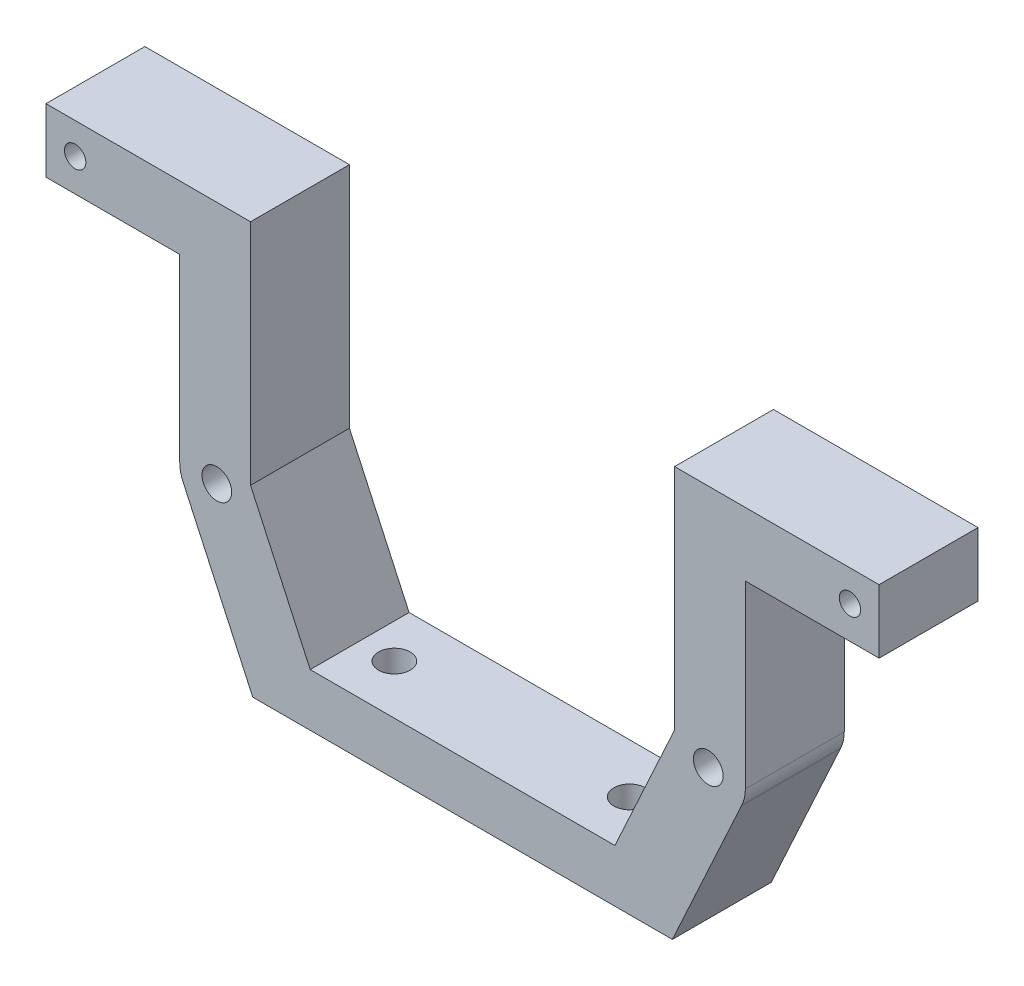
ISO-10303-21;
HEADER;
FILE_DESCRIPTION(('STEP AP214'),'2;1');
FILE_NAME('part.step','',(''),(''),'','','');
FILE_SCHEMA(('AUTOMOTIVE_DESIGN { 1 0 10303 214 1 1 1 1 }'));
ENDSEC;
DATA;
#1=APPLICATION_CONTEXT('core data for automotive mechanical design processes');
#2=APPLICATION_PROTOCOL_DEFINITION('international standard','automotive_design',2000,#1);
#3=PRODUCT_CONTEXT('',#1,'mechanical');
#4=PRODUCT('Part','Part','',(#3));
#5=PRODUCT_RELATED_PRODUCT_CATEGORY('part','',(#4));
#6=PRODUCT_DEFINITION_FORMATION('','',#4);
#7=PRODUCT_DEFINITION_CONTEXT('part definition',#1,'design');
#8=PRODUCT_DEFINITION('design','',#6,#7);
#9=PRODUCT_DEFINITION_SHAPE('','',#8);
#10=(LENGTH_UNIT() NAMED_UNIT(*) SI_UNIT(.MILLI.,.METRE.));
#11=(NAMED_UNIT(*) PLANE_ANGLE_UNIT() SI_UNIT($,.RADIAN.));
#12=(NAMED_UNIT(*) SI_UNIT($,.STERADIAN.) SOLID_ANGLE_UNIT());
#13=UNCERTAINTY_MEASURE_WITH_UNIT(LENGTH_MEASURE(1.E-05),#10,'distance_accuracy_value','');
#14=(GEOMETRIC_REPRESENTATION_CONTEXT(3) GLOBAL_UNCERTAINTY_ASSIGNED_CONTEXT((#13)) GLOBAL_UNIT_ASSIGNED_CONTEXT((#10,
#11,#12)) REPRESENTATION_CONTEXT('',''));
#15=CARTESIAN_POINT('',(0.,0.,0.));
#16=DIRECTION('',(0.,0.,1.));
#17=DIRECTION('',(1.,0.,0.));
#18=AXIS2_PLACEMENT_3D('',#15,#16,#17);
#19=CARTESIAN_POINT('',(31.5545702888792,8.97930902224725,12.7));
#20=DIRECTION('',(0.,0.,-1.));
#21=DIRECTION('',(-1.,0.,0.));
#22=AXIS2_PLACEMENT_3D('',#19,#20,#21);
#23=PLANE('',#22);
#24=CARTESIAN_POINT('',(31.5545702888792,8.97930902224725,12.7));
#25=DIRECTION('',(0.,0.,1.));
#26=DIRECTION('',(-1.,0.,0.));
#27=AXIS2_PLACEMENT_3D('',#24,#25,#26);
#28=CIRCLE('',#27,1.905);
#29=CARTESIAN_POINT('',(29.6495702888792,8.97930902224725,12.7));
#30=VERTEX_POINT('',#29);
#31=EDGE_CURVE('E290',#30,#30,#28,.T.);
#32=ORIENTED_EDGE('',*,*,#31,.F.);
#33=EDGE_LOOP('',(#32));
#34=FACE_BOUND('',#33,.T.);
#35=CARTESIAN_POINT('',(-49.7493059568274,36.2842713695044,12.7));
#36=DIRECTION('',(0.,0.,1.));
#37=DIRECTION('',(1.,0.,0.));
#38=AXIS2_PLACEMENT_3D('',#35,#36,#37);
#39=CIRCLE('',#38,1.3716);
#40=CARTESIAN_POINT('',(-48.3777059568274,36.2842713695044,12.7));
#41=VERTEX_POINT('',#40);
#42=EDGE_CURVE('E198',#41,#41,#39,.T.);
#43=ORIENTED_EDGE('',*,*,#42,.F.);
#44=EDGE_LOOP('',(#43));
#45=FACE_BOUND('',#44,.T.);
#46=DIRECTION('',(0.,1.,0.));
#47=VECTOR('',#46,1.);
#48=CARTESIAN_POINT('',(-27.2257695935493,40.2784040455911,12.7));
#49=LINE('',#48,#47);
#50=CARTESIAN_POINT('',(-27.2257695935493,10.9692609139896,12.7));
#51=VERTEX_POINT('',#50);
#52=CARTESIAN_POINT('',(-27.2257695935493,40.2784040455911,12.7));
#53=VERTEX_POINT('',#52);
#54=EDGE_CURVE('E229',#51,#53,#49,.T.);
#55=ORIENTED_EDGE('',*,*,#54,.T.);
#56=DIRECTION('',(-1.,0.,0.));
#57=VECTOR('',#56,1.);
#58=CARTESIAN_POINT('',(-53.4924781457748,40.2784040455911,12.7));
#59=LINE('',#58,#57);
#60=CARTESIAN_POINT('',(-53.4924781457748,40.2784040455911,12.7));
#61=VERTEX_POINT('',#60);
#62=EDGE_CURVE('E127',#53,#61,#59,.T.);
#63=ORIENTED_EDGE('',*,*,#62,.T.);
#64=DIRECTION('',(0.,-1.,0.));
#65=VECTOR('',#64,1.);
#66=CARTESIAN_POINT('',(-53.4924781457748,32.0981433403628,12.7));
#67=LINE('',#66,#65);
#68=CARTESIAN_POINT('',(-53.4924781457748,32.0981433403628,12.7));
#69=VERTEX_POINT('',#68);
#70=EDGE_CURVE('E308',#61,#69,#67,.T.);
#71=ORIENTED_EDGE('',*,*,#70,.T.);
#72=DIRECTION('',(1.,0.,0.));
#73=VECTOR('',#72,1.);
#74=CARTESIAN_POINT('',(-36.3188565933879,32.0981433403628,12.7));
#75=LINE('',#74,#73);
#76=CARTESIAN_POINT('',(-36.3188565933879,32.0981433403628,12.7));
#77=VERTEX_POINT('',#76);
#78=EDGE_CURVE('E310',#69,#77,#75,.T.);
#79=ORIENTED_EDGE('',*,*,#78,.T.);
#80=DIRECTION('',(0.,-1.,0.));
#81=VECTOR('',#80,1.);
#82=CARTESIAN_POINT('',(-36.318856593388,8.97930902224725,12.7));
#83=LINE('',#82,#81);
#84=CARTESIAN_POINT('',(-36.318856593388,8.97930902224725,12.7));
#85=VERTEX_POINT('',#84);
#86=EDGE_CURVE('E312',#77,#85,#83,.T.);
#87=ORIENTED_EDGE('',*,*,#86,.T.);
#88=CARTESIAN_POINT('',(-31.5545702888788,8.97930902224726,12.7));
#89=DIRECTION('',(0.,0.,1.));
#90=DIRECTION('',(1.,0.,0.));
#91=AXIS2_PLACEMENT_3D('',#88,#89,#90);
#92=CIRCLE('',#91,4.76428630450919);
#93=CARTESIAN_POINT('',(-35.8252422231693,6.86748866506799,12.7));
#94=VERTEX_POINT('',#93);
#95=EDGE_CURVE('E314',#85,#94,#92,.T.);
#96=ORIENTED_EDGE('',*,*,#95,.T.);
#97=DIRECTION('',(0.417681004993124,-0.908593736533515,0.));
#98=VECTOR('',#97,1.);
#99=CARTESIAN_POINT('',(-26.9440305515199,-12.4520714806509,12.7));
#100=LINE('',#99,#98);
#101=CARTESIAN_POINT('',(-26.9440305515199,-12.4520714806509,12.7));
#102=VERTEX_POINT('',#101);
#103=EDGE_CURVE('E316',#94,#102,#100,.T.);
#104=ORIENTED_EDGE('',*,*,#103,.T.);
#105=DIRECTION('',(1.,0.,0.));
#106=VECTOR('',#105,1.);
#107=CARTESIAN_POINT('',(26.94403055152,-12.4520714806509,12.7));
#108=LINE('',#107,#106);
#109=CARTESIAN_POINT('',(26.94403055152,-12.4520714806509,12.7));
#110=VERTEX_POINT('',#109);
#111=EDGE_CURVE('E318',#102,#110,#108,.T.);
#112=ORIENTED_EDGE('',*,*,#111,.T.);
#113=DIRECTION('',(0.417681004993124,0.908593736533515,0.));
#114=VECTOR('',#113,1.);
#115=CARTESIAN_POINT('',(26.94403055152,-12.4520714806509,12.7));
#116=LINE('',#115,#114);
#117=CARTESIAN_POINT('',(35.8252422231693,6.867488665068,12.7));
#118=VERTEX_POINT('',#117);
#119=EDGE_CURVE('E320',#110,#118,#116,.T.);
#120=ORIENTED_EDGE('',*,*,#119,.T.);
#121=CARTESIAN_POINT('',(31.5545702888792,8.97930902224725,12.7));
#122=DIRECTION('',(0.,0.,1.));
#123=DIRECTION('',(-1.,0.,0.));
#124=AXIS2_PLACEMENT_3D('',#121,#122,#123);
#125=CIRCLE('',#124,4.76428630450882);
#126=CARTESIAN_POINT('',(36.318856593388,8.97930902224725,12.7));
#127=VERTEX_POINT('',#126);
#128=EDGE_CURVE('E322',#118,#127,#125,.T.);
#129=ORIENTED_EDGE('',*,*,#128,.T.);
#130=DIRECTION('',(0.,1.,0.));
#131=VECTOR('',#130,1.);
#132=CARTESIAN_POINT('',(36.318856593388,8.97930902224725,12.7));
#133=LINE('',#132,#131);
#134=CARTESIAN_POINT('',(36.3188565933879,32.0981433403628,12.7));
#135=VERTEX_POINT('',#134);
#136=EDGE_CURVE('E324',#127,#135,#133,.T.);
#137=ORIENTED_EDGE('',*,*,#136,.T.);
#138=DIRECTION('',(1.,0.,0.));
#139=VECTOR('',#138,1.);
#140=CARTESIAN_POINT('',(36.3188565933879,32.0981433403628,12.7));
#141=LINE('',#140,#139);
#142=CARTESIAN_POINT('',(53.4924781457748,32.0981433403628,12.7));
#143=VERTEX_POINT('',#142);
#144=EDGE_CURVE('E326',#135,#143,#141,.T.);
#145=ORIENTED_EDGE('',*,*,#144,.T.);
#146=DIRECTION('',(0.,1.,0.));
#147=VECTOR('',#146,1.);
#148=CARTESIAN_POINT('',(53.4924781457748,32.0981433403628,12.7));
#149=LINE('',#148,#147);
#150=CARTESIAN_POINT('',(53.4924781457748,40.2784040455911,12.7));
#151=VERTEX_POINT('',#150);
#152=EDGE_CURVE('E328',#143,#151,#149,.T.);
#153=ORIENTED_EDGE('',*,*,#152,.T.);
#154=DIRECTION('',(-1.,0.,0.));
#155=VECTOR('',#154,1.);
#156=CARTESIAN_POINT('',(53.4924781457748,40.2784040455911,12.7));
#157=LINE('',#156,#155);
#158=CARTESIAN_POINT('',(27.2257695935493,40.2784040455911,12.7));
#159=VERTEX_POINT('',#158);
#160=EDGE_CURVE('E330',#151,#159,#157,.T.);
#161=ORIENTED_EDGE('',*,*,#160,.T.);
#162=DIRECTION('',(0.,-1.,0.));
#163=VECTOR('',#162,1.);
#164=CARTESIAN_POINT('',(27.2257695935493,40.2784040455911,12.7));
#165=LINE('',#164,#163);
#166=CARTESIAN_POINT('',(27.2257695935493,10.9692609139896,12.7));
#167=VERTEX_POINT('',#166);
#168=EDGE_CURVE('E176',#159,#167,#165,.T.);
#169=ORIENTED_EDGE('',*,*,#168,.T.);
#170=DIRECTION('',(-0.417681004993123,-0.908593736533515,0.));
#171=VECTOR('',#170,1.);
#172=CARTESIAN_POINT('',(27.2257695935493,10.9692609139896,12.7));
#173=LINE('',#172,#171);
#174=CARTESIAN_POINT('',(19.564927607776,-5.69559327290649,12.7));
#175=VERTEX_POINT('',#174);
#176=EDGE_CURVE('E170',#167,#175,#173,.T.);
#177=ORIENTED_EDGE('',*,*,#176,.T.);
#178=DIRECTION('',(-1.,0.,0.));
#179=VECTOR('',#178,1.);
#180=CARTESIAN_POINT('',(-19.564927607776,-5.69559327290649,12.7));
#181=LINE('',#180,#179);
#182=CARTESIAN_POINT('',(-19.564927607776,-5.69559327290649,12.7));
#183=VERTEX_POINT('',#182);
#184=EDGE_CURVE('E174',#175,#183,#181,.T.);
#185=ORIENTED_EDGE('',*,*,#184,.T.);
#186=DIRECTION('',(-0.417681004993124,0.908593736533515,0.));
#187=VECTOR('',#186,1.);
#188=CARTESIAN_POINT('',(-27.2257695935493,10.9692609139896,12.7));
#189=LINE('',#188,#187);
#190=EDGE_CURVE('E54',#183,#51,#189,.T.);
#191=ORIENTED_EDGE('',*,*,#190,.T.);
#192=EDGE_LOOP('',(#55,#63,#71,#79,#87,#96,#104,#112,#120,#129,#137,#145,#153,#161,#169,#177,
#185,#191));
#193=FACE_BOUND('',#192,.T.);
#194=CARTESIAN_POINT('',(49.7493059568274,36.2842713695044,12.7));
#195=DIRECTION('',(0.,0.,1.));
#196=DIRECTION('',(-1.,0.,0.));
#197=AXIS2_PLACEMENT_3D('',#194,#195,#196);
#198=CIRCLE('',#197,1.3716);
#199=CARTESIAN_POINT('',(48.3777059568274,36.2842713695044,12.7));
#200=VERTEX_POINT('',#199);
#201=EDGE_CURVE('E296',#200,#200,#198,.T.);
#202=ORIENTED_EDGE('',*,*,#201,.F.);
#203=EDGE_LOOP('',(#202));
#204=FACE_BOUND('',#203,.T.);
#205=CARTESIAN_POINT('',(-31.5545702888788,8.97930902224726,12.7));
#206=DIRECTION('',(0.,0.,1.));
#207=DIRECTION('',(1.,0.,0.));
#208=AXIS2_PLACEMENT_3D('',#205,#206,#207);
#209=CIRCLE('',#208,1.905);
#210=CARTESIAN_POINT('',(-29.6495702888788,8.97930902224726,12.7));
#211=VERTEX_POINT('',#210);
#212=EDGE_CURVE('E277',#211,#211,#209,.T.);
#213=ORIENTED_EDGE('',*,*,#212,.F.);
#214=EDGE_LOOP('',(#213));
#215=FACE_BOUND('',#214,.T.);
#216=ADVANCED_FACE('F35',(#34,#45,#193,#204,#215),#23,.F.);
#217=CARTESIAN_POINT('',(31.5545702888792,8.97930902224725,0.));
#218=DIRECTION('',(0.,0.,-1.));
#219=DIRECTION('',(-1.,0.,0.));
#220=AXIS2_PLACEMENT_3D('',#217,#218,#219);
#221=PLANE('',#220);
#222=CARTESIAN_POINT('',(31.5545702888792,8.97930902224725,0.));
#223=DIRECTION('',(0.,0.,1.));
#224=DIRECTION('',(-1.,0.,0.));
#225=AXIS2_PLACEMENT_3D('',#222,#223,#224);
#226=CIRCLE('',#225,1.905);
#227=CARTESIAN_POINT('',(29.6495702888792,8.97930902224725,0.));
#228=VERTEX_POINT('',#227);
#229=EDGE_CURVE('E288',#228,#228,#226,.T.);
#230=ORIENTED_EDGE('',*,*,#229,.T.);
#231=EDGE_LOOP('',(#230));
#232=FACE_BOUND('',#231,.T.);
#233=CARTESIAN_POINT('',(-49.7493059568274,36.2842713695044,0.));
#234=DIRECTION('',(0.,0.,1.));
#235=DIRECTION('',(1.,0.,0.));
#236=AXIS2_PLACEMENT_3D('',#233,#234,#235);
#237=CIRCLE('',#236,1.3716);
#238=CARTESIAN_POINT('',(-48.3777059568274,36.2842713695044,0.));
#239=VERTEX_POINT('',#238);
#240=EDGE_CURVE('E299',#239,#239,#237,.T.);
#241=ORIENTED_EDGE('',*,*,#240,.T.);
#242=EDGE_LOOP('',(#241));
#243=FACE_BOUND('',#242,.T.);
#244=DIRECTION('',(0.,1.,0.));
#245=VECTOR('',#244,1.);
#246=CARTESIAN_POINT('',(-27.2257695935493,40.2784040455911,0.));
#247=LINE('',#246,#245);
#248=CARTESIAN_POINT('',(-27.2257695935493,10.9692609139896,0.));
#249=VERTEX_POINT('',#248);
#250=CARTESIAN_POINT('',(-27.2257695935493,40.2784040455911,0.));
#251=VERTEX_POINT('',#250);
#252=EDGE_CURVE('E194',#249,#251,#247,.T.);
#253=ORIENTED_EDGE('',*,*,#252,.F.);
#254=DIRECTION('',(-0.417681004993124,0.908593736533515,0.));
#255=VECTOR('',#254,1.);
#256=CARTESIAN_POINT('',(-27.2257695935493,10.9692609139896,0.));
#257=LINE('',#256,#255);
#258=CARTESIAN_POINT('',(-19.564927607776,-5.69559327290649,0.));
#259=VERTEX_POINT('',#258);
#260=EDGE_CURVE('E119',#259,#249,#257,.T.);
#261=ORIENTED_EDGE('',*,*,#260,.F.);
#262=DIRECTION('',(-1.,0.,0.));
#263=VECTOR('',#262,1.);
#264=CARTESIAN_POINT('',(-19.564927607776,-5.69559327290649,0.));
#265=LINE('',#264,#263);
#266=CARTESIAN_POINT('',(19.564927607776,-5.69559327290649,0.));
#267=VERTEX_POINT('',#266);
#268=EDGE_CURVE('E113',#267,#259,#265,.T.);
#269=ORIENTED_EDGE('',*,*,#268,.F.);
#270=DIRECTION('',(-0.417681004993123,-0.908593736533515,0.));
#271=VECTOR('',#270,1.);
#272=CARTESIAN_POINT('',(27.2257695935493,10.9692609139896,0.));
#273=LINE('',#272,#271);
#274=CARTESIAN_POINT('',(27.2257695935493,10.9692609139896,0.));
#275=VERTEX_POINT('',#274);
#276=EDGE_CURVE('E184',#275,#267,#273,.T.);
#277=ORIENTED_EDGE('',*,*,#276,.F.);
#278=DIRECTION('',(0.,-1.,0.));
#279=VECTOR('',#278,1.);
#280=CARTESIAN_POINT('',(27.2257695935493,40.2784040455911,0.));
#281=LINE('',#280,#279);
#282=CARTESIAN_POINT('',(27.2257695935493,40.2784040455911,0.));
#283=VERTEX_POINT('',#282);
#284=EDGE_CURVE('E224',#283,#275,#281,.T.);
#285=ORIENTED_EDGE('',*,*,#284,.F.);
#286=DIRECTION('',(-1.,0.,0.));
#287=VECTOR('',#286,1.);
#288=CARTESIAN_POINT('',(53.4924781457748,40.2784040455911,0.));
#289=LINE('',#288,#287);
#290=CARTESIAN_POINT('',(53.4924781457748,40.2784040455911,0.));
#291=VERTEX_POINT('',#290);
#292=EDGE_CURVE('E222',#291,#283,#289,.T.);
#293=ORIENTED_EDGE('',*,*,#292,.F.);
#294=DIRECTION('',(0.,1.,0.));
#295=VECTOR('',#294,1.);
#296=CARTESIAN_POINT('',(53.4924781457748,32.0981433403628,0.));
#297=LINE('',#296,#295);
#298=CARTESIAN_POINT('',(53.4924781457748,32.0981433403628,0.));
#299=VERTEX_POINT('',#298);
#300=EDGE_CURVE('E220',#299,#291,#297,.T.);
#301=ORIENTED_EDGE('',*,*,#300,.F.);
#302=DIRECTION('',(1.,0.,0.));
#303=VECTOR('',#302,1.);
#304=CARTESIAN_POINT('',(36.3188565933879,32.0981433403628,0.));
#305=LINE('',#304,#303);
#306=CARTESIAN_POINT('',(36.3188565933879,32.0981433403628,0.));
#307=VERTEX_POINT('',#306);
#308=EDGE_CURVE('E218',#307,#299,#305,.T.);
#309=ORIENTED_EDGE('',*,*,#308,.F.);
#310=DIRECTION('',(0.,1.,0.));
#311=VECTOR('',#310,1.);
#312=CARTESIAN_POINT('',(36.318856593388,8.97930902224725,0.));
#313=LINE('',#312,#311);
#314=CARTESIAN_POINT('',(36.318856593388,8.97930902224725,0.));
#315=VERTEX_POINT('',#314);
#316=EDGE_CURVE('E216',#315,#307,#313,.T.);
#317=ORIENTED_EDGE('',*,*,#316,.F.);
#318=CARTESIAN_POINT('',(31.5545702888792,8.97930902224725,0.));
#319=DIRECTION('',(0.,0.,1.));
#320=DIRECTION('',(-1.,0.,0.));
#321=AXIS2_PLACEMENT_3D('',#318,#319,#320);
#322=CIRCLE('',#321,4.76428630450882);
#323=CARTESIAN_POINT('',(35.8252422231693,6.867488665068,0.));
#324=VERTEX_POINT('',#323);
#325=EDGE_CURVE('E214',#324,#315,#322,.T.);
#326=ORIENTED_EDGE('',*,*,#325,.F.);
#327=DIRECTION('',(0.417681004993124,0.908593736533515,0.));
#328=VECTOR('',#327,1.);
#329=CARTESIAN_POINT('',(26.94403055152,-12.4520714806509,0.));
#330=LINE('',#329,#328);
#331=CARTESIAN_POINT('',(26.94403055152,-12.4520714806509,0.));
#332=VERTEX_POINT('',#331);
#333=EDGE_CURVE('E212',#332,#324,#330,.T.);
#334=ORIENTED_EDGE('',*,*,#333,.F.);
#335=DIRECTION('',(1.,0.,0.));
#336=VECTOR('',#335,1.);
#337=CARTESIAN_POINT('',(26.94403055152,-12.4520714806509,0.));
#338=LINE('',#337,#336);
#339=CARTESIAN_POINT('',(-26.9440305515199,-12.4520714806509,0.));
#340=VERTEX_POINT('',#339);
#341=EDGE_CURVE('E210',#340,#332,#338,.T.);
#342=ORIENTED_EDGE('',*,*,#341,.F.);
#343=DIRECTION('',(0.417681004993124,-0.908593736533515,0.));
#344=VECTOR('',#343,1.);
#345=CARTESIAN_POINT('',(-26.9440305515199,-12.4520714806509,0.));
#346=LINE('',#345,#344);
#347=CARTESIAN_POINT('',(-35.8252422231693,6.86748866506799,0.));
#348=VERTEX_POINT('',#347);
#349=EDGE_CURVE('E208',#348,#340,#346,.T.);
#350=ORIENTED_EDGE('',*,*,#349,.F.);
#351=CARTESIAN_POINT('',(-31.5545702888788,8.97930902224726,0.));
#352=DIRECTION('',(0.,0.,1.));
#353=DIRECTION('',(1.,0.,0.));
#354=AXIS2_PLACEMENT_3D('',#351,#352,#353);
#355=CIRCLE('',#354,4.76428630450919);
#356=CARTESIAN_POINT('',(-36.318856593388,8.97930902224725,0.));
#357=VERTEX_POINT('',#356);
#358=EDGE_CURVE('E206',#357,#348,#355,.T.);
#359=ORIENTED_EDGE('',*,*,#358,.F.);
#360=DIRECTION('',(0.,-1.,0.));
#361=VECTOR('',#360,1.);
#362=CARTESIAN_POINT('',(-36.318856593388,8.97930902224725,0.));
#363=LINE('',#362,#361);
#364=CARTESIAN_POINT('',(-36.3188565933879,32.0981433403628,0.));
#365=VERTEX_POINT('',#364);
#366=EDGE_CURVE('E204',#365,#357,#363,.T.);
#367=ORIENTED_EDGE('',*,*,#366,.F.);
#368=DIRECTION('',(1.,0.,0.));
#369=VECTOR('',#368,1.);
#370=CARTESIAN_POINT('',(-36.3188565933879,32.0981433403628,0.));
#371=LINE('',#370,#369);
#372=CARTESIAN_POINT('',(-53.4924781457748,32.0981433403628,0.));
#373=VERTEX_POINT('',#372);
#374=EDGE_CURVE('E202',#373,#365,#371,.T.);
#375=ORIENTED_EDGE('',*,*,#374,.F.);
#376=DIRECTION('',(0.,-1.,0.));
#377=VECTOR('',#376,1.);
#378=CARTESIAN_POINT('',(-53.4924781457748,32.0981433403628,0.));
#379=LINE('',#378,#377);
#380=CARTESIAN_POINT('',(-53.4924781457748,40.2784040455911,0.));
#381=VERTEX_POINT('',#380);
#382=EDGE_CURVE('E200',#381,#373,#379,.T.);
#383=ORIENTED_EDGE('',*,*,#382,.F.);
#384=DIRECTION('',(-1.,0.,0.));
#385=VECTOR('',#384,1.);
#386=CARTESIAN_POINT('',(-53.4924781457748,40.2784040455911,0.));
#387=LINE('',#386,#385);
#388=EDGE_CURVE('E197',#251,#381,#387,.T.);
#389=ORIENTED_EDGE('',*,*,#388,.F.);
#390=EDGE_LOOP('',(#253,#261,#269,#277,#285,#293,#301,#309,#317,#326,#334,#342,#350,#359,#367,
#375,#383,#389));
#391=FACE_BOUND('',#390,.T.);
#392=CARTESIAN_POINT('',(49.7493059568274,36.2842713695044,0.));
#393=DIRECTION('',(0.,0.,1.));
#394=DIRECTION('',(-1.,0.,0.));
#395=AXIS2_PLACEMENT_3D('',#392,#393,#394);
#396=CIRCLE('',#395,1.3716);
#397=CARTESIAN_POINT('',(48.3777059568274,36.2842713695044,0.));
#398=VERTEX_POINT('',#397);
#399=EDGE_CURVE('E293',#398,#398,#396,.T.);
#400=ORIENTED_EDGE('',*,*,#399,.T.);
#401=EDGE_LOOP('',(#400));
#402=FACE_BOUND('',#401,.T.);
#403=CARTESIAN_POINT('',(-31.5545702888788,8.97930902224726,0.));
#404=DIRECTION('',(0.,0.,1.));
#405=DIRECTION('',(1.,0.,0.));
#406=AXIS2_PLACEMENT_3D('',#403,#404,#405);
#407=CIRCLE('',#406,1.905);
#408=CARTESIAN_POINT('',(-29.6495702888788,8.97930902224726,0.));
#409=VERTEX_POINT('',#408);
#410=EDGE_CURVE('E272',#409,#409,#407,.T.);
#411=ORIENTED_EDGE('',*,*,#410,.T.);
#412=EDGE_LOOP('',(#411));
#413=FACE_BOUND('',#412,.T.);
#414=ADVANCED_FACE('F343',(#232,#243,#391,#402,#413),#221,.T.);
#415=CARTESIAN_POINT('',(-27.2257695935493,40.2784040455911,12.7));
#416=DIRECTION('',(-1.,0.,0.));
#417=DIRECTION('',(0.,0.,1.));
#418=AXIS2_PLACEMENT_3D('',#415,#416,#417);
#419=PLANE('',#418);
#420=ORIENTED_EDGE('',*,*,#252,.T.);
#421=DIRECTION('',(0.,0.,-1.));
#422=VECTOR('',#421,1.);
#423=CARTESIAN_POINT('',(-27.2257695935493,40.2784040455911,12.7));
#424=LINE('',#423,#422);
#425=EDGE_CURVE('E11',#53,#251,#424,.T.);
#426=ORIENTED_EDGE('',*,*,#425,.F.);
#427=ORIENTED_EDGE('',*,*,#54,.F.);
#428=DIRECTION('',(0.,0.,-1.));
#429=VECTOR('',#428,1.);
#430=CARTESIAN_POINT('',(-27.2257695935493,10.9692609139896,12.7));
#431=LINE('',#430,#429);
#432=EDGE_CURVE('E190',#51,#249,#431,.T.);
#433=ORIENTED_EDGE('',*,*,#432,.T.);
#434=EDGE_LOOP('',(#420,#426,#427,#433));
#435=FACE_BOUND('',#434,.T.);
#436=ADVANCED_FACE('F37',(#435),#419,.F.);
#437=CARTESIAN_POINT('',(-53.4924781457748,40.2784040455911,12.7));
#438=DIRECTION('',(0.,-1.,0.));
#439=DIRECTION('',(0.,0.,-1.));
#440=AXIS2_PLACEMENT_3D('',#437,#438,#439);
#441=PLANE('',#440);
#442=ORIENTED_EDGE('',*,*,#388,.T.);
#443=DIRECTION('',(0.,0.,-1.));
#444=VECTOR('',#443,1.);
#445=CARTESIAN_POINT('',(-53.4924781457748,40.2784040455911,12.7));
#446=LINE('',#445,#444);
#447=EDGE_CURVE('E45',#61,#381,#446,.T.);
#448=ORIENTED_EDGE('',*,*,#447,.F.);
#449=ORIENTED_EDGE('',*,*,#62,.F.);
#450=ORIENTED_EDGE('',*,*,#425,.T.);
#451=EDGE_LOOP('',(#442,#448,#449,#450));
#452=FACE_BOUND('',#451,.T.);
#453=ADVANCED_FACE('F447',(#452),#441,.F.);
#454=CARTESIAN_POINT('',(-53.4924781457748,32.0981433403628,12.7));
#455=DIRECTION('',(1.,0.,0.));
#456=DIRECTION('',(0.,0.,-1.));
#457=AXIS2_PLACEMENT_3D('',#454,#455,#456);
#458=PLANE('',#457);
#459=ORIENTED_EDGE('',*,*,#382,.T.);
#460=DIRECTION('',(0.,0.,-1.));
#461=VECTOR('',#460,1.);
#462=CARTESIAN_POINT('',(-53.4924781457748,32.0981433403628,12.7));
#463=LINE('',#462,#461);
#464=EDGE_CURVE('E266',#69,#373,#463,.T.);
#465=ORIENTED_EDGE('',*,*,#464,.F.);
#466=ORIENTED_EDGE('',*,*,#70,.F.);
#467=ORIENTED_EDGE('',*,*,#447,.T.);
#468=EDGE_LOOP('',(#459,#465,#466,#467));
#469=FACE_BOUND('',#468,.T.);
#470=ADVANCED_FACE('F445',(#469),#458,.F.);
#471=CARTESIAN_POINT('',(-36.3188565933879,32.0981433403628,12.7));
#472=DIRECTION('',(0.,1.,0.));
#473=DIRECTION('',(0.,0.,1.));
#474=AXIS2_PLACEMENT_3D('',#471,#472,#473);
#475=PLANE('',#474);
#476=ORIENTED_EDGE('',*,*,#374,.T.);
#477=DIRECTION('',(0.,0.,-1.));
#478=VECTOR('',#477,1.);
#479=CARTESIAN_POINT('',(-36.3188565933879,32.0981433403628,12.7));
#480=LINE('',#479,#478);
#481=EDGE_CURVE('E263',#77,#365,#480,.T.);
#482=ORIENTED_EDGE('',*,*,#481,.F.);
#483=ORIENTED_EDGE('',*,*,#78,.F.);
#484=ORIENTED_EDGE('',*,*,#464,.T.);
#485=EDGE_LOOP('',(#476,#482,#483,#484));
#486=FACE_BOUND('',#485,.T.);
#487=ADVANCED_FACE('F442',(#486),#475,.F.);
#488=CARTESIAN_POINT('',(-36.318856593388,8.97930902224725,12.7));
#489=DIRECTION('',(1.,0.,0.));
#490=DIRECTION('',(0.,1.,0.));
#491=AXIS2_PLACEMENT_3D('',#488,#489,#490);
#492=PLANE('',#491);
#493=ORIENTED_EDGE('',*,*,#366,.T.);
#494=DIRECTION('',(0.,0.,-1.));
#495=VECTOR('',#494,1.);
#496=CARTESIAN_POINT('',(-36.318856593388,8.97930902224725,12.7));
#497=LINE('',#496,#495);
#498=EDGE_CURVE('E260',#85,#357,#497,.T.);
#499=ORIENTED_EDGE('',*,*,#498,.F.);
#500=ORIENTED_EDGE('',*,*,#86,.F.);
#501=ORIENTED_EDGE('',*,*,#481,.T.);
#502=EDGE_LOOP('',(#493,#499,#500,#501));
#503=FACE_BOUND('',#502,.T.);
#504=ADVANCED_FACE('F438',(#503),#492,.F.);
#505=CARTESIAN_POINT('',(-31.5545702888788,8.97930902224726,12.7));
#506=DIRECTION('',(0.,0.,-1.));
#507=DIRECTION('',(-1.,0.,0.));
#508=AXIS2_PLACEMENT_3D('',#505,#506,#507);
#509=CYLINDRICAL_SURFACE('',#508,4.76428630450919);
#510=ORIENTED_EDGE('',*,*,#358,.T.);
#511=DIRECTION('',(0.,0.,-1.));
#512=VECTOR('',#511,1.);
#513=CARTESIAN_POINT('',(-35.8252422231693,6.86748866506799,12.7));
#514=LINE('',#513,#512);
#515=EDGE_CURVE('E257',#94,#348,#514,.T.);
#516=ORIENTED_EDGE('',*,*,#515,.F.);
#517=ORIENTED_EDGE('',*,*,#95,.F.);
#518=ORIENTED_EDGE('',*,*,#498,.T.);
#519=EDGE_LOOP('',(#510,#516,#517,#518));
#520=FACE_BOUND('',#519,.T.);
#521=ADVANCED_FACE('F434',(#520),#509,.T.);
#522=CARTESIAN_POINT('',(-26.9440305515199,-12.4520714806509,12.7));
#523=DIRECTION('',(0.908593736533515,0.417681004993124,0.));
#524=DIRECTION('',(-0.417681004993124,0.908593736533515,0.));
#525=AXIS2_PLACEMENT_3D('',#522,#523,#524);
#526=PLANE('',#525);
#527=ORIENTED_EDGE('',*,*,#349,.T.);
#528=DIRECTION('',(0.,0.,-1.));
#529=VECTOR('',#528,1.);
#530=CARTESIAN_POINT('',(-26.9440305515199,-12.4520714806509,12.7));
#531=LINE('',#530,#529);
#532=EDGE_CURVE('E254',#102,#340,#531,.T.);
#533=ORIENTED_EDGE('',*,*,#532,.F.);
#534=ORIENTED_EDGE('',*,*,#103,.F.);
#535=ORIENTED_EDGE('',*,*,#515,.T.);
#536=EDGE_LOOP('',(#527,#533,#534,#535));
#537=FACE_BOUND('',#536,.T.);
#538=ADVANCED_FACE('F401',(#537),#526,.F.);
#539=CARTESIAN_POINT('',(26.94403055152,-12.4520714806509,12.7));
#540=DIRECTION('',(0.,1.,0.));
#541=DIRECTION('',(0.,0.,1.));
#542=AXIS2_PLACEMENT_3D('',#539,#540,#541);
#543=PLANE('',#542);
#544=CARTESIAN_POINT('',(15.1051301031544,-12.4520714806509,6.35));
#545=DIRECTION('',(0.,-1.,0.));
#546=DIRECTION('',(0.,0.,-1.));
#547=AXIS2_PLACEMENT_3D('',#544,#545,#546);
#548=CIRCLE('',#547,2.032);
#549=CARTESIAN_POINT('',(15.1051301031544,-12.4520714806509,4.318));
#550=VERTEX_POINT('',#549);
#551=EDGE_CURVE('E284',#550,#550,#548,.T.);
#552=ORIENTED_EDGE('',*,*,#551,.F.);
#553=EDGE_LOOP('',(#552));
#554=FACE_BOUND('',#553,.T.);
#555=CARTESIAN_POINT('',(-15.1051301031544,-12.4520714806509,6.35));
#556=DIRECTION('',(0.,-1.,0.));
#557=DIRECTION('',(0.,0.,1.));
#558=AXIS2_PLACEMENT_3D('',#555,#556,#557);
#559=CIRCLE('',#558,2.032);
#560=CARTESIAN_POINT('',(-15.1051301031544,-12.4520714806509,8.382));
#561=VERTEX_POINT('',#560);
#562=EDGE_CURVE('E273',#561,#561,#559,.T.);
#563=ORIENTED_EDGE('',*,*,#562,.F.);
#564=EDGE_LOOP('',(#563));
#565=FACE_BOUND('',#564,.T.);
#566=ORIENTED_EDGE('',*,*,#341,.T.);
#567=DIRECTION('',(0.,0.,-1.));
#568=VECTOR('',#567,1.);
#569=CARTESIAN_POINT('',(26.94403055152,-12.4520714806509,12.7));
#570=LINE('',#569,#568);
#571=EDGE_CURVE('E251',#110,#332,#570,.T.);
#572=ORIENTED_EDGE('',*,*,#571,.F.);
#573=ORIENTED_EDGE('',*,*,#111,.F.);
#574=ORIENTED_EDGE('',*,*,#532,.T.);
#575=EDGE_LOOP('',(#566,#572,#573,#574));
#576=FACE_BOUND('',#575,.T.);
#577=ADVANCED_FACE('F397',(#554,#565,#576),#543,.F.);
#578=CARTESIAN_POINT('',(26.94403055152,-12.4520714806509,12.7));
#579=DIRECTION('',(-0.908593736533515,0.417681004993124,0.));
#580=DIRECTION('',(-0.417681004993124,-0.908593736533515,0.));
#581=AXIS2_PLACEMENT_3D('',#578,#579,#580);
#582=PLANE('',#581);
#583=ORIENTED_EDGE('',*,*,#333,.T.);
#584=DIRECTION('',(0.,0.,-1.));
#585=VECTOR('',#584,1.);
#586=CARTESIAN_POINT('',(35.8252422231693,6.867488665068,12.7));
#587=LINE('',#586,#585);
#588=EDGE_CURVE('E248',#118,#324,#587,.T.);
#589=ORIENTED_EDGE('',*,*,#588,.F.);
#590=ORIENTED_EDGE('',*,*,#119,.F.);
#591=ORIENTED_EDGE('',*,*,#571,.T.);
#592=EDGE_LOOP('',(#583,#589,#590,#591));
#593=FACE_BOUND('',#592,.T.);
#594=ADVANCED_FACE('F400',(#593),#582,.F.);
#595=CARTESIAN_POINT('',(31.5545702888792,8.97930902224725,12.7));
#596=DIRECTION('',(0.,0.,-1.));
#597=DIRECTION('',(-1.,0.,0.));
#598=AXIS2_PLACEMENT_3D('',#595,#596,#597);
#599=CYLINDRICAL_SURFACE('',#598,4.76428630450882);
#600=ORIENTED_EDGE('',*,*,#325,.T.);
#601=DIRECTION('',(0.,0.,-1.));
#602=VECTOR('',#601,1.);
#603=CARTESIAN_POINT('',(36.318856593388,8.97930902224725,12.7));
#604=LINE('',#603,#602);
#605=EDGE_CURVE('E245',#127,#315,#604,.T.);
#606=ORIENTED_EDGE('',*,*,#605,.F.);
#607=ORIENTED_EDGE('',*,*,#128,.F.);
#608=ORIENTED_EDGE('',*,*,#588,.T.);
#609=EDGE_LOOP('',(#600,#606,#607,#608));
#610=FACE_BOUND('',#609,.T.);
#611=ADVANCED_FACE('F418',(#610),#599,.T.);
#612=CARTESIAN_POINT('',(36.318856593388,8.97930902224725,12.7));
#613=DIRECTION('',(-1.,0.,0.));
#614=DIRECTION('',(0.,-1.,0.));
#615=AXIS2_PLACEMENT_3D('',#612,#613,#614);
#616=PLANE('',#615);
#617=ORIENTED_EDGE('',*,*,#316,.T.);
#618=DIRECTION('',(0.,0.,-1.));
#619=VECTOR('',#618,1.);
#620=CARTESIAN_POINT('',(36.3188565933879,32.0981433403628,12.7));
#621=LINE('',#620,#619);
#622=EDGE_CURVE('E242',#135,#307,#621,.T.);
#623=ORIENTED_EDGE('',*,*,#622,.F.);
#624=ORIENTED_EDGE('',*,*,#136,.F.);
#625=ORIENTED_EDGE('',*,*,#605,.T.);
#626=EDGE_LOOP('',(#617,#623,#624,#625));
#627=FACE_BOUND('',#626,.T.);
#628=ADVANCED_FACE('F422',(#627),#616,.F.);
#629=CARTESIAN_POINT('',(36.3188565933879,32.0981433403628,12.7));
#630=DIRECTION('',(0.,1.,0.));
#631=DIRECTION('',(0.,0.,1.));
#632=AXIS2_PLACEMENT_3D('',#629,#630,#631);
#633=PLANE('',#632);
#634=ORIENTED_EDGE('',*,*,#308,.T.);
#635=DIRECTION('',(0.,0.,-1.));
#636=VECTOR('',#635,1.);
#637=CARTESIAN_POINT('',(53.4924781457748,32.0981433403628,12.7));
#638=LINE('',#637,#636);
#639=EDGE_CURVE('E239',#143,#299,#638,.T.);
#640=ORIENTED_EDGE('',*,*,#639,.F.);
#641=ORIENTED_EDGE('',*,*,#144,.F.);
#642=ORIENTED_EDGE('',*,*,#622,.T.);
#643=EDGE_LOOP('',(#634,#640,#641,#642));
#644=FACE_BOUND('',#643,.T.);
#645=ADVANCED_FACE('F469',(#644),#633,.F.);
#646=CARTESIAN_POINT('',(53.4924781457748,32.0981433403628,12.7));
#647=DIRECTION('',(-1.,0.,0.));
#648=DIRECTION('',(0.,0.,1.));
#649=AXIS2_PLACEMENT_3D('',#646,#647,#648);
#650=PLANE('',#649);
#651=ORIENTED_EDGE('',*,*,#300,.T.);
#652=DIRECTION('',(0.,0.,-1.));
#653=VECTOR('',#652,1.);
#654=CARTESIAN_POINT('',(53.4924781457748,40.2784040455911,12.7));
#655=LINE('',#654,#653);
#656=EDGE_CURVE('E236',#151,#291,#655,.T.);
#657=ORIENTED_EDGE('',*,*,#656,.F.);
#658=ORIENTED_EDGE('',*,*,#152,.F.);
#659=ORIENTED_EDGE('',*,*,#639,.T.);
#660=EDGE_LOOP('',(#651,#657,#658,#659));
#661=FACE_BOUND('',#660,.T.);
#662=ADVANCED_FACE('F472',(#661),#650,.F.);
#663=CARTESIAN_POINT('',(53.4924781457748,40.2784040455911,12.7));
#664=DIRECTION('',(0.,-1.,0.));
#665=DIRECTION('',(0.,0.,-1.));
#666=AXIS2_PLACEMENT_3D('',#663,#664,#665);
#667=PLANE('',#666);
#668=ORIENTED_EDGE('',*,*,#292,.T.);
#669=DIRECTION('',(0.,0.,-1.));
#670=VECTOR('',#669,1.);
#671=CARTESIAN_POINT('',(27.2257695935493,40.2784040455911,12.7));
#672=LINE('',#671,#670);
#673=EDGE_CURVE('E233',#159,#283,#672,.T.);
#674=ORIENTED_EDGE('',*,*,#673,.F.);
#675=ORIENTED_EDGE('',*,*,#160,.F.);
#676=ORIENTED_EDGE('',*,*,#656,.T.);
#677=EDGE_LOOP('',(#668,#674,#675,#676));
#678=FACE_BOUND('',#677,.T.);
#679=ADVANCED_FACE('F336',(#678),#667,.F.);
#680=CARTESIAN_POINT('',(27.2257695935493,40.2784040455911,12.7));
#681=DIRECTION('',(1.,0.,0.));
#682=DIRECTION('',(0.,0.,-1.));
#683=AXIS2_PLACEMENT_3D('',#680,#681,#682);
#684=PLANE('',#683);
#685=ORIENTED_EDGE('',*,*,#284,.T.);
#686=DIRECTION('',(0.,0.,-1.));
#687=VECTOR('',#686,1.);
#688=CARTESIAN_POINT('',(27.2257695935493,10.9692609139896,12.7));
#689=LINE('',#688,#687);
#690=EDGE_CURVE('E185',#167,#275,#689,.T.);
#691=ORIENTED_EDGE('',*,*,#690,.F.);
#692=ORIENTED_EDGE('',*,*,#168,.F.);
#693=ORIENTED_EDGE('',*,*,#673,.T.);
#694=EDGE_LOOP('',(#685,#691,#692,#693));
#695=FACE_BOUND('',#694,.T.);
#696=ADVANCED_FACE('F340',(#695),#684,.F.);
#697=CARTESIAN_POINT('',(27.2257695935493,10.9692609139896,12.7));
#698=DIRECTION('',(0.908593736533515,-0.417681004993123,0.));
#699=DIRECTION('',(0.417681004993123,0.908593736533515,0.));
#700=AXIS2_PLACEMENT_3D('',#697,#698,#699);
#701=PLANE('',#700);
#702=ORIENTED_EDGE('',*,*,#276,.T.);
#703=DIRECTION('',(0.,0.,-1.));
#704=VECTOR('',#703,1.);
#705=CARTESIAN_POINT('',(19.564927607776,-5.69559327290649,12.7));
#706=LINE('',#705,#704);
#707=EDGE_CURVE('E181',#175,#267,#706,.T.);
#708=ORIENTED_EDGE('',*,*,#707,.F.);
#709=ORIENTED_EDGE('',*,*,#176,.F.);
#710=ORIENTED_EDGE('',*,*,#690,.T.);
#711=EDGE_LOOP('',(#702,#708,#709,#710));
#712=FACE_BOUND('',#711,.T.);
#713=ADVANCED_FACE('F182',(#712),#701,.F.);
#714=CARTESIAN_POINT('',(-19.564927607776,-5.69559327290649,12.7));
#715=DIRECTION('',(0.,-1.,0.));
#716=DIRECTION('',(0.,0.,-1.));
#717=AXIS2_PLACEMENT_3D('',#714,#715,#716);
#718=PLANE('',#717);
#719=CARTESIAN_POINT('',(15.1051301031544,-5.69559327290649,6.35));
#720=DIRECTION('',(0.,-1.,0.));
#721=DIRECTION('',(0.,0.,-1.));
#722=AXIS2_PLACEMENT_3D('',#719,#720,#721);
#723=CIRCLE('',#722,2.032);
#724=CARTESIAN_POINT('',(15.1051301031544,-5.69559327290649,4.318));
#725=VERTEX_POINT('',#724);
#726=EDGE_CURVE('E39',#725,#725,#723,.T.);
#727=ORIENTED_EDGE('',*,*,#726,.T.);
#728=EDGE_LOOP('',(#727));
#729=FACE_BOUND('',#728,.T.);
#730=CARTESIAN_POINT('',(-15.1051301031544,-5.69559327290649,6.35));
#731=DIRECTION('',(0.,-1.,0.));
#732=DIRECTION('',(0.,0.,-1.));
#733=AXIS2_PLACEMENT_3D('',#730,#731,#732);
#734=CIRCLE('',#733,2.032);
#735=CARTESIAN_POINT('',(-15.1051301031544,-5.69559327290649,4.318));
#736=VERTEX_POINT('',#735);
#737=EDGE_CURVE('E270',#736,#736,#734,.T.);
#738=ORIENTED_EDGE('',*,*,#737,.T.);
#739=EDGE_LOOP('',(#738));
#740=FACE_BOUND('',#739,.T.);
#741=ORIENTED_EDGE('',*,*,#268,.T.);
#742=DIRECTION('',(0.,0.,-1.));
#743=VECTOR('',#742,1.);
#744=CARTESIAN_POINT('',(-19.564927607776,-5.69559327290649,12.7));
#745=LINE('',#744,#743);
#746=EDGE_CURVE('E186',#183,#259,#745,.T.);
#747=ORIENTED_EDGE('',*,*,#746,.F.);
#748=ORIENTED_EDGE('',*,*,#184,.F.);
#749=ORIENTED_EDGE('',*,*,#707,.T.);
#750=EDGE_LOOP('',(#741,#747,#748,#749));
#751=FACE_BOUND('',#750,.T.);
#752=ADVANCED_FACE('F188',(#729,#740,#751),#718,.F.);
#753=CARTESIAN_POINT('',(-27.2257695935493,10.9692609139896,12.7));
#754=DIRECTION('',(-0.908593736533515,-0.417681004993124,0.));
#755=DIRECTION('',(0.417681004993124,-0.908593736533515,0.));
#756=AXIS2_PLACEMENT_3D('',#753,#754,#755);
#757=PLANE('',#756);
#758=ORIENTED_EDGE('',*,*,#260,.T.);
#759=ORIENTED_EDGE('',*,*,#432,.F.);
#760=ORIENTED_EDGE('',*,*,#190,.F.);
#761=ORIENTED_EDGE('',*,*,#746,.T.);
#762=EDGE_LOOP('',(#758,#759,#760,#761));
#763=FACE_BOUND('',#762,.T.);
#764=ADVANCED_FACE('F349',(#763),#757,.F.);
#765=CARTESIAN_POINT('',(-49.7493059568274,36.2842713695044,12.7));
#766=DIRECTION('',(0.,0.,-1.));
#767=DIRECTION('',(-1.,0.,0.));
#768=AXIS2_PLACEMENT_3D('',#765,#766,#767);
#769=CYLINDRICAL_SURFACE('',#768,1.3716);
#770=ORIENTED_EDGE('',*,*,#42,.T.);
#771=EDGE_LOOP('',(#770));
#772=FACE_BOUND('',#771,.T.);
#773=ORIENTED_EDGE('',*,*,#240,.F.);
#774=EDGE_LOOP('',(#773));
#775=FACE_BOUND('',#774,.T.);
#776=ADVANCED_FACE('F351',(#772,#775),#769,.F.);
#777=CARTESIAN_POINT('',(49.7493059568274,36.2842713695044,12.7));
#778=DIRECTION('',(0.,0.,-1.));
#779=DIRECTION('',(-1.,0.,0.));
#780=AXIS2_PLACEMENT_3D('',#777,#778,#779);
#781=CYLINDRICAL_SURFACE('',#780,1.3716);
#782=ORIENTED_EDGE('',*,*,#201,.T.);
#783=EDGE_LOOP('',(#782));
#784=FACE_BOUND('',#783,.T.);
#785=ORIENTED_EDGE('',*,*,#399,.F.);
#786=EDGE_LOOP('',(#785));
#787=FACE_BOUND('',#786,.T.);
#788=ADVANCED_FACE('F357',(#784,#787),#781,.F.);
#789=CARTESIAN_POINT('',(31.5545702888792,8.97930902224725,12.7));
#790=DIRECTION('',(0.,0.,-1.));
#791=DIRECTION('',(-1.,0.,0.));
#792=AXIS2_PLACEMENT_3D('',#789,#790,#791);
#793=CYLINDRICAL_SURFACE('',#792,1.905);
#794=ORIENTED_EDGE('',*,*,#31,.T.);
#795=EDGE_LOOP('',(#794));
#796=FACE_BOUND('',#795,.T.);
#797=ORIENTED_EDGE('',*,*,#229,.F.);
#798=EDGE_LOOP('',(#797));
#799=FACE_BOUND('',#798,.T.);
#800=ADVANCED_FACE('F375',(#796,#799),#793,.F.);
#801=CARTESIAN_POINT('',(-31.5545702888788,8.97930902224726,12.7));
#802=DIRECTION('',(0.,0.,-1.));
#803=DIRECTION('',(-1.,0.,0.));
#804=AXIS2_PLACEMENT_3D('',#801,#802,#803);
#805=CYLINDRICAL_SURFACE('',#804,1.905);
#806=ORIENTED_EDGE('',*,*,#212,.T.);
#807=EDGE_LOOP('',(#806));
#808=FACE_BOUND('',#807,.T.);
#809=ORIENTED_EDGE('',*,*,#410,.F.);
#810=EDGE_LOOP('',(#809));
#811=FACE_BOUND('',#810,.T.);
#812=ADVANCED_FACE('F379',(#808,#811),#805,.F.);
#813=CARTESIAN_POINT('',(-15.1051301031544,-2.80007148065092,6.35));
#814=DIRECTION('',(0.,-1.,0.));
#815=DIRECTION('',(0.,0.,-1.));
#816=AXIS2_PLACEMENT_3D('',#813,#814,#815);
#817=CYLINDRICAL_SURFACE('',#816,2.032);
#818=ORIENTED_EDGE('',*,*,#562,.T.);
#819=EDGE_LOOP('',(#818));
#820=FACE_BOUND('',#819,.T.);
#821=ORIENTED_EDGE('',*,*,#737,.F.);
#822=EDGE_LOOP('',(#821));
#823=FACE_BOUND('',#822,.T.);
#824=ADVANCED_FACE('F383',(#820,#823),#817,.F.);
#825=CARTESIAN_POINT('',(15.1051301031544,-2.80007148065092,6.35));
#826=DIRECTION('',(0.,-1.,0.));
#827=DIRECTION('',(0.,0.,-1.));
#828=AXIS2_PLACEMENT_3D('',#825,#826,#827);
#829=CYLINDRICAL_SURFACE('',#828,2.032);
#830=ORIENTED_EDGE('',*,*,#551,.T.);
#831=EDGE_LOOP('',(#830));
#832=FACE_BOUND('',#831,.T.);
#833=ORIENTED_EDGE('',*,*,#726,.F.);
#834=EDGE_LOOP('',(#833));
#835=FACE_BOUND('',#834,.T.);
#836=ADVANCED_FACE('F387',(#832,#835),#829,.F.);
#837=CLOSED_SHELL('',(#216,#414,#436,#453,#470,#487,#504,#521,#538,#577,#594,#611,#628,#645,
#662,#679,#696,#713,#752,#764,#776,#788,#800,#812,#824,#836));
#838=MANIFOLD_SOLID_BREP('B2',#837);
#839=ADVANCED_BREP_SHAPE_REPRESENTATION('',(#18,#838),#14);
#840=SHAPE_DEFINITION_REPRESENTATION(#9,#839);
ENDSEC;
END-ISO-10303-21;
